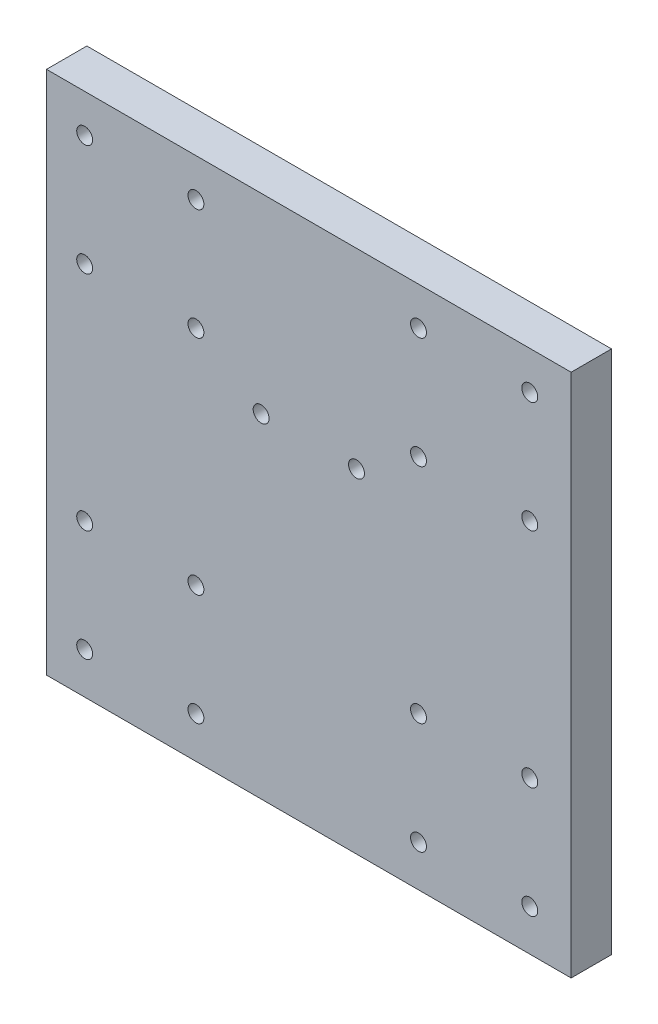
ISO-10303-21;
HEADER;
FILE_DESCRIPTION(('STEP AP214'),'2;1');
FILE_NAME('part.step','',(''),(''),'','','');
FILE_SCHEMA(('AUTOMOTIVE_DESIGN { 1 0 10303 214 1 1 1 1 }'));
ENDSEC;
DATA;
#1=APPLICATION_CONTEXT('core data for automotive mechanical design processes');
#2=APPLICATION_PROTOCOL_DEFINITION('international standard','automotive_design',2000,#1);
#3=PRODUCT_CONTEXT('',#1,'mechanical');
#4=PRODUCT('Part','Part','',(#3));
#5=PRODUCT_RELATED_PRODUCT_CATEGORY('part','',(#4));
#6=PRODUCT_DEFINITION_FORMATION('','',#4);
#7=PRODUCT_DEFINITION_CONTEXT('part definition',#1,'design');
#8=PRODUCT_DEFINITION('design','',#6,#7);
#9=PRODUCT_DEFINITION_SHAPE('','',#8);
#10=(LENGTH_UNIT() NAMED_UNIT(*) SI_UNIT(.MILLI.,.METRE.));
#11=(NAMED_UNIT(*) PLANE_ANGLE_UNIT() SI_UNIT($,.RADIAN.));
#12=(NAMED_UNIT(*) SI_UNIT($,.STERADIAN.) SOLID_ANGLE_UNIT());
#13=UNCERTAINTY_MEASURE_WITH_UNIT(LENGTH_MEASURE(1.E-05),#10,'distance_accuracy_value','');
#14=(GEOMETRIC_REPRESENTATION_CONTEXT(3) GLOBAL_UNCERTAINTY_ASSIGNED_CONTEXT((#13)) GLOBAL_UNIT_ASSIGNED_CONTEXT((#10,
#11,#12)) REPRESENTATION_CONTEXT('',''));
#15=CARTESIAN_POINT('',(0.,0.,0.));
#16=DIRECTION('',(0.,0.,1.));
#17=DIRECTION('',(1.,0.,0.));
#18=AXIS2_PLACEMENT_3D('',#15,#16,#17);
#19=CARTESIAN_POINT('',(0.,0.,12.7));
#20=DIRECTION('',(0.,0.,1.));
#21=DIRECTION('',(1.,0.,0.));
#22=AXIS2_PLACEMENT_3D('',#19,#20,#21);
#23=PLANE('',#22);
#24=CARTESIAN_POINT('',(15.,22.3901064883606,12.7));
#25=DIRECTION('',(0.,0.,1.));
#26=DIRECTION('',(1.,0.,0.));
#27=AXIS2_PLACEMENT_3D('',#24,#25,#26);
#28=CIRCLE('',#27,2.5);
#29=CARTESIAN_POINT('',(17.5,22.3901064883606,12.7));
#30=VERTEX_POINT('',#29);
#31=EDGE_CURVE('E214',#30,#30,#28,.T.);
#32=ORIENTED_EDGE('',*,*,#31,.F.);
#33=EDGE_LOOP('',(#32));
#34=FACE_BOUND('',#33,.T.);
#35=CARTESIAN_POINT('',(-15.,22.3901064883606,12.7));
#36=DIRECTION('',(0.,0.,1.));
#37=DIRECTION('',(1.,0.,0.));
#38=AXIS2_PLACEMENT_3D('',#35,#36,#37);
#39=CIRCLE('',#38,2.5);
#40=CARTESIAN_POINT('',(-12.5,22.3901064883606,12.7));
#41=VERTEX_POINT('',#40);
#42=EDGE_CURVE('E208',#41,#41,#39,.T.);
#43=ORIENTED_EDGE('',*,*,#42,.F.);
#44=EDGE_LOOP('',(#43));
#45=FACE_BOUND('',#44,.T.);
#46=CARTESIAN_POINT('',(-35.4999999999985,-69.5,12.7));
#47=DIRECTION('',(0.,0.,1.));
#48=DIRECTION('',(1.,0.,0.));
#49=AXIS2_PLACEMENT_3D('',#46,#47,#48);
#50=CIRCLE('',#49,2.5);
#51=CARTESIAN_POINT('',(-32.9999999999985,-69.5,12.7));
#52=VERTEX_POINT('',#51);
#53=EDGE_CURVE('E193',#52,#52,#50,.T.);
#54=ORIENTED_EDGE('',*,*,#53,.F.);
#55=EDGE_LOOP('',(#54));
#56=FACE_BOUND('',#55,.T.);
#57=CARTESIAN_POINT('',(-70.4999999999989,-34.5,12.7));
#58=DIRECTION('',(0.,0.,1.));
#59=DIRECTION('',(1.,0.,0.));
#60=AXIS2_PLACEMENT_3D('',#57,#58,#59);
#61=CIRCLE('',#60,2.5);
#62=CARTESIAN_POINT('',(-67.9999999999989,-34.5,12.7));
#63=VERTEX_POINT('',#62);
#64=EDGE_CURVE('E181',#63,#63,#61,.T.);
#65=ORIENTED_EDGE('',*,*,#64,.F.);
#66=EDGE_LOOP('',(#65));
#67=FACE_BOUND('',#66,.T.);
#68=CARTESIAN_POINT('',(69.5000000000014,-69.5,12.7));
#69=DIRECTION('',(0.,0.,1.));
#70=DIRECTION('',(1.,0.,0.));
#71=AXIS2_PLACEMENT_3D('',#68,#69,#70);
#72=CIRCLE('',#71,2.5);
#73=CARTESIAN_POINT('',(72.0000000000014,-69.5,12.7));
#74=VERTEX_POINT('',#73);
#75=EDGE_CURVE('E169',#74,#74,#72,.T.);
#76=ORIENTED_EDGE('',*,*,#75,.F.);
#77=EDGE_LOOP('',(#76));
#78=FACE_BOUND('',#77,.T.);
#79=CARTESIAN_POINT('',(34.5000000000011,-34.5,12.7));
#80=DIRECTION('',(0.,0.,1.));
#81=DIRECTION('',(1.,0.,0.));
#82=AXIS2_PLACEMENT_3D('',#79,#80,#81);
#83=CIRCLE('',#82,2.5);
#84=CARTESIAN_POINT('',(37.0000000000011,-34.5,12.7));
#85=VERTEX_POINT('',#84);
#86=EDGE_CURVE('E157',#85,#85,#83,.T.);
#87=ORIENTED_EDGE('',*,*,#86,.F.);
#88=EDGE_LOOP('',(#87));
#89=FACE_BOUND('',#88,.T.);
#90=CARTESIAN_POINT('',(69.5000000000004,35.5,12.7));
#91=DIRECTION('',(0.,0.,1.));
#92=DIRECTION('',(1.,0.,0.));
#93=AXIS2_PLACEMENT_3D('',#90,#91,#92);
#94=CIRCLE('',#93,2.5);
#95=CARTESIAN_POINT('',(72.0000000000004,35.5,12.7));
#96=VERTEX_POINT('',#95);
#97=EDGE_CURVE('E145',#96,#96,#94,.T.);
#98=ORIENTED_EDGE('',*,*,#97,.F.);
#99=EDGE_LOOP('',(#98));
#100=FACE_BOUND('',#99,.T.);
#101=CARTESIAN_POINT('',(34.5,70.5,12.7));
#102=DIRECTION('',(0.,0.,1.));
#103=DIRECTION('',(1.,0.,0.));
#104=AXIS2_PLACEMENT_3D('',#101,#102,#103);
#105=CIRCLE('',#104,2.5);
#106=CARTESIAN_POINT('',(37.,70.5,12.7));
#107=VERTEX_POINT('',#106);
#108=EDGE_CURVE('E133',#107,#107,#105,.T.);
#109=ORIENTED_EDGE('',*,*,#108,.F.);
#110=EDGE_LOOP('',(#109));
#111=FACE_BOUND('',#110,.T.);
#112=CARTESIAN_POINT('',(-35.4999999999996,35.5,12.7));
#113=DIRECTION('',(0.,0.,1.));
#114=DIRECTION('',(1.,0.,0.));
#115=AXIS2_PLACEMENT_3D('',#112,#113,#114);
#116=CIRCLE('',#115,2.5);
#117=CARTESIAN_POINT('',(-32.9999999999996,35.5,12.7));
#118=VERTEX_POINT('',#117);
#119=EDGE_CURVE('E121',#118,#118,#116,.T.);
#120=ORIENTED_EDGE('',*,*,#119,.F.);
#121=EDGE_LOOP('',(#120));
#122=FACE_BOUND('',#121,.T.);
#123=CARTESIAN_POINT('',(-70.5,70.5,12.7));
#124=DIRECTION('',(0.,0.,1.));
#125=DIRECTION('',(1.,0.,0.));
#126=AXIS2_PLACEMENT_3D('',#123,#124,#125);
#127=CIRCLE('',#126,2.5);
#128=CARTESIAN_POINT('',(-68.,70.5,12.7));
#129=VERTEX_POINT('',#128);
#130=EDGE_CURVE('E100',#129,#129,#127,.T.);
#131=ORIENTED_EDGE('',*,*,#130,.F.);
#132=EDGE_LOOP('',(#131));
#133=FACE_BOUND('',#132,.T.);
#134=DIRECTION('',(0.,-1.,0.));
#135=VECTOR('',#134,1.);
#136=CARTESIAN_POINT('',(-82.5,-82.5,12.7));
#137=LINE('',#136,#135);
#138=CARTESIAN_POINT('',(-82.5,82.5,12.7));
#139=VERTEX_POINT('',#138);
#140=CARTESIAN_POINT('',(-82.5,-82.5,12.7));
#141=VERTEX_POINT('',#140);
#142=EDGE_CURVE('E85',#139,#141,#137,.T.);
#143=ORIENTED_EDGE('',*,*,#142,.T.);
#144=DIRECTION('',(1.,0.,0.));
#145=VECTOR('',#144,1.);
#146=CARTESIAN_POINT('',(82.5,-82.5,12.7));
#147=LINE('',#146,#145);
#148=CARTESIAN_POINT('',(82.5,-82.5,12.7));
#149=VERTEX_POINT('',#148);
#150=EDGE_CURVE('E80',#141,#149,#147,.T.);
#151=ORIENTED_EDGE('',*,*,#150,.T.);
#152=DIRECTION('',(0.,1.,0.));
#153=VECTOR('',#152,1.);
#154=CARTESIAN_POINT('',(82.5,-82.5,12.7));
#155=LINE('',#154,#153);
#156=CARTESIAN_POINT('',(82.5,82.5,12.7));
#157=VERTEX_POINT('',#156);
#158=EDGE_CURVE('E83',#149,#157,#155,.T.);
#159=ORIENTED_EDGE('',*,*,#158,.T.);
#160=DIRECTION('',(-1.,0.,0.));
#161=VECTOR('',#160,1.);
#162=CARTESIAN_POINT('',(82.5,82.5,12.7));
#163=LINE('',#162,#161);
#164=EDGE_CURVE('E50',#157,#139,#163,.T.);
#165=ORIENTED_EDGE('',*,*,#164,.T.);
#166=EDGE_LOOP('',(#143,#151,#159,#165));
#167=FACE_BOUND('',#166,.T.);
#168=CARTESIAN_POINT('',(-35.5,70.5,12.7));
#169=DIRECTION('',(0.,0.,1.));
#170=DIRECTION('',(1.,0.,0.));
#171=AXIS2_PLACEMENT_3D('',#168,#169,#170);
#172=CIRCLE('',#171,2.5);
#173=CARTESIAN_POINT('',(-33.,70.5,12.7));
#174=VERTEX_POINT('',#173);
#175=EDGE_CURVE('E115',#174,#174,#172,.T.);
#176=ORIENTED_EDGE('',*,*,#175,.F.);
#177=EDGE_LOOP('',(#176));
#178=FACE_BOUND('',#177,.T.);
#179=CARTESIAN_POINT('',(-70.4999999999996,35.5,12.7));
#180=DIRECTION('',(0.,0.,1.));
#181=DIRECTION('',(1.,0.,0.));
#182=AXIS2_PLACEMENT_3D('',#179,#180,#181);
#183=CIRCLE('',#182,2.5);
#184=CARTESIAN_POINT('',(-67.9999999999996,35.5,12.7));
#185=VERTEX_POINT('',#184);
#186=EDGE_CURVE('E127',#185,#185,#183,.T.);
#187=ORIENTED_EDGE('',*,*,#186,.F.);
#188=EDGE_LOOP('',(#187));
#189=FACE_BOUND('',#188,.T.);
#190=CARTESIAN_POINT('',(69.5,70.5,12.7));
#191=DIRECTION('',(0.,0.,1.));
#192=DIRECTION('',(1.,0.,0.));
#193=AXIS2_PLACEMENT_3D('',#190,#191,#192);
#194=CIRCLE('',#193,2.5);
#195=CARTESIAN_POINT('',(72.,70.5,12.7));
#196=VERTEX_POINT('',#195);
#197=EDGE_CURVE('E139',#196,#196,#194,.T.);
#198=ORIENTED_EDGE('',*,*,#197,.F.);
#199=EDGE_LOOP('',(#198));
#200=FACE_BOUND('',#199,.T.);
#201=CARTESIAN_POINT('',(34.5000000000003,35.5,12.7));
#202=DIRECTION('',(0.,0.,1.));
#203=DIRECTION('',(1.,0.,0.));
#204=AXIS2_PLACEMENT_3D('',#201,#202,#203);
#205=CIRCLE('',#204,2.5);
#206=CARTESIAN_POINT('',(37.0000000000003,35.5,12.7));
#207=VERTEX_POINT('',#206);
#208=EDGE_CURVE('E151',#207,#207,#205,.T.);
#209=ORIENTED_EDGE('',*,*,#208,.F.);
#210=EDGE_LOOP('',(#209));
#211=FACE_BOUND('',#210,.T.);
#212=CARTESIAN_POINT('',(69.5000000000011,-34.5,12.7));
#213=DIRECTION('',(0.,0.,1.));
#214=DIRECTION('',(1.,0.,0.));
#215=AXIS2_PLACEMENT_3D('',#212,#213,#214);
#216=CIRCLE('',#215,2.5);
#217=CARTESIAN_POINT('',(72.0000000000011,-34.5,12.7));
#218=VERTEX_POINT('',#217);
#219=EDGE_CURVE('E163',#218,#218,#216,.T.);
#220=ORIENTED_EDGE('',*,*,#219,.F.);
#221=EDGE_LOOP('',(#220));
#222=FACE_BOUND('',#221,.T.);
#223=CARTESIAN_POINT('',(34.5000000000014,-69.5,12.7));
#224=DIRECTION('',(0.,0.,1.));
#225=DIRECTION('',(1.,0.,0.));
#226=AXIS2_PLACEMENT_3D('',#223,#224,#225);
#227=CIRCLE('',#226,2.5);
#228=CARTESIAN_POINT('',(37.0000000000014,-69.5,12.7));
#229=VERTEX_POINT('',#228);
#230=EDGE_CURVE('E175',#229,#229,#227,.T.);
#231=ORIENTED_EDGE('',*,*,#230,.F.);
#232=EDGE_LOOP('',(#231));
#233=FACE_BOUND('',#232,.T.);
#234=CARTESIAN_POINT('',(-35.4999999999989,-34.5,12.7));
#235=DIRECTION('',(0.,0.,1.));
#236=DIRECTION('',(1.,0.,0.));
#237=AXIS2_PLACEMENT_3D('',#234,#235,#236);
#238=CIRCLE('',#237,2.5);
#239=CARTESIAN_POINT('',(-32.9999999999989,-34.5,12.7));
#240=VERTEX_POINT('',#239);
#241=EDGE_CURVE('E187',#240,#240,#238,.T.);
#242=ORIENTED_EDGE('',*,*,#241,.F.);
#243=EDGE_LOOP('',(#242));
#244=FACE_BOUND('',#243,.T.);
#245=CARTESIAN_POINT('',(-70.4999999999986,-69.5,12.7));
#246=DIRECTION('',(0.,0.,1.));
#247=DIRECTION('',(1.,0.,0.));
#248=AXIS2_PLACEMENT_3D('',#245,#246,#247);
#249=CIRCLE('',#248,2.5);
#250=CARTESIAN_POINT('',(-67.9999999999986,-69.5,12.7));
#251=VERTEX_POINT('',#250);
#252=EDGE_CURVE('E199',#251,#251,#249,.T.);
#253=ORIENTED_EDGE('',*,*,#252,.F.);
#254=EDGE_LOOP('',(#253));
#255=FACE_BOUND('',#254,.T.);
#256=ADVANCED_FACE('F33',(#34,#45,#56,#67,#78,#89,#100,#111,#122,#133,#167,#178,#189,#200,#211,
#222,#233,#244,#255),#23,.T.);
#257=CARTESIAN_POINT('',(0.,0.,0.));
#258=DIRECTION('',(0.,0.,1.));
#259=DIRECTION('',(1.,0.,0.));
#260=AXIS2_PLACEMENT_3D('',#257,#258,#259);
#261=PLANE('',#260);
#262=CARTESIAN_POINT('',(15.,22.3901064883606,0.));
#263=DIRECTION('',(0.,0.,1.));
#264=DIRECTION('',(1.,0.,0.));
#265=AXIS2_PLACEMENT_3D('',#262,#263,#264);
#266=CIRCLE('',#265,2.5);
#267=CARTESIAN_POINT('',(17.5,22.3901064883606,0.));
#268=VERTEX_POINT('',#267);
#269=EDGE_CURVE('E211',#268,#268,#266,.T.);
#270=ORIENTED_EDGE('',*,*,#269,.T.);
#271=EDGE_LOOP('',(#270));
#272=FACE_BOUND('',#271,.T.);
#273=CARTESIAN_POINT('',(-15.,22.3901064883606,0.));
#274=DIRECTION('',(0.,0.,1.));
#275=DIRECTION('',(1.,0.,0.));
#276=AXIS2_PLACEMENT_3D('',#273,#274,#275);
#277=CIRCLE('',#276,2.5);
#278=CARTESIAN_POINT('',(-12.5,22.3901064883606,0.));
#279=VERTEX_POINT('',#278);
#280=EDGE_CURVE('E205',#279,#279,#277,.T.);
#281=ORIENTED_EDGE('',*,*,#280,.T.);
#282=EDGE_LOOP('',(#281));
#283=FACE_BOUND('',#282,.T.);
#284=DIRECTION('',(0.,-1.,0.));
#285=VECTOR('',#284,1.);
#286=CARTESIAN_POINT('',(-82.5,-82.5,0.));
#287=LINE('',#286,#285);
#288=CARTESIAN_POINT('',(-82.5,82.5,0.));
#289=VERTEX_POINT('',#288);
#290=CARTESIAN_POINT('',(-82.5,-82.5,0.));
#291=VERTEX_POINT('',#290);
#292=EDGE_CURVE('E97',#289,#291,#287,.T.);
#293=ORIENTED_EDGE('',*,*,#292,.F.);
#294=DIRECTION('',(-1.,0.,0.));
#295=VECTOR('',#294,1.);
#296=CARTESIAN_POINT('',(82.5,82.5,0.));
#297=LINE('',#296,#295);
#298=CARTESIAN_POINT('',(82.5,82.5,0.));
#299=VERTEX_POINT('',#298);
#300=EDGE_CURVE('E73',#299,#289,#297,.T.);
#301=ORIENTED_EDGE('',*,*,#300,.F.);
#302=DIRECTION('',(0.,1.,0.));
#303=VECTOR('',#302,1.);
#304=CARTESIAN_POINT('',(82.5,-82.5,0.));
#305=LINE('',#304,#303);
#306=CARTESIAN_POINT('',(82.5,-82.5,0.));
#307=VERTEX_POINT('',#306);
#308=EDGE_CURVE('E67',#307,#299,#305,.T.);
#309=ORIENTED_EDGE('',*,*,#308,.F.);
#310=DIRECTION('',(1.,0.,0.));
#311=VECTOR('',#310,1.);
#312=CARTESIAN_POINT('',(82.5,-82.5,0.));
#313=LINE('',#312,#311);
#314=EDGE_CURVE('E89',#291,#307,#313,.T.);
#315=ORIENTED_EDGE('',*,*,#314,.F.);
#316=EDGE_LOOP('',(#293,#301,#309,#315));
#317=FACE_BOUND('',#316,.T.);
#318=CARTESIAN_POINT('',(-70.5,70.5,0.));
#319=DIRECTION('',(0.,0.,1.));
#320=DIRECTION('',(1.,0.,0.));
#321=AXIS2_PLACEMENT_3D('',#318,#319,#320);
#322=CIRCLE('',#321,2.5);
#323=CARTESIAN_POINT('',(-68.,70.5,0.));
#324=VERTEX_POINT('',#323);
#325=EDGE_CURVE('E112',#324,#324,#322,.T.);
#326=ORIENTED_EDGE('',*,*,#325,.T.);
#327=EDGE_LOOP('',(#326));
#328=FACE_BOUND('',#327,.T.);
#329=CARTESIAN_POINT('',(-35.5,70.5,0.));
#330=DIRECTION('',(0.,0.,1.));
#331=DIRECTION('',(1.,0.,0.));
#332=AXIS2_PLACEMENT_3D('',#329,#330,#331);
#333=CIRCLE('',#332,2.5);
#334=CARTESIAN_POINT('',(-33.,70.5,0.));
#335=VERTEX_POINT('',#334);
#336=EDGE_CURVE('E118',#335,#335,#333,.T.);
#337=ORIENTED_EDGE('',*,*,#336,.T.);
#338=EDGE_LOOP('',(#337));
#339=FACE_BOUND('',#338,.T.);
#340=CARTESIAN_POINT('',(-35.4999999999996,35.5,0.));
#341=DIRECTION('',(0.,0.,1.));
#342=DIRECTION('',(1.,0.,0.));
#343=AXIS2_PLACEMENT_3D('',#340,#341,#342);
#344=CIRCLE('',#343,2.5);
#345=CARTESIAN_POINT('',(-32.9999999999996,35.5,0.));
#346=VERTEX_POINT('',#345);
#347=EDGE_CURVE('E124',#346,#346,#344,.T.);
#348=ORIENTED_EDGE('',*,*,#347,.T.);
#349=EDGE_LOOP('',(#348));
#350=FACE_BOUND('',#349,.T.);
#351=CARTESIAN_POINT('',(-70.4999999999996,35.5,0.));
#352=DIRECTION('',(0.,0.,1.));
#353=DIRECTION('',(1.,0.,0.));
#354=AXIS2_PLACEMENT_3D('',#351,#352,#353);
#355=CIRCLE('',#354,2.5);
#356=CARTESIAN_POINT('',(-67.9999999999996,35.5,0.));
#357=VERTEX_POINT('',#356);
#358=EDGE_CURVE('E130',#357,#357,#355,.T.);
#359=ORIENTED_EDGE('',*,*,#358,.T.);
#360=EDGE_LOOP('',(#359));
#361=FACE_BOUND('',#360,.T.);
#362=CARTESIAN_POINT('',(34.5,70.5,0.));
#363=DIRECTION('',(0.,0.,1.));
#364=DIRECTION('',(1.,0.,0.));
#365=AXIS2_PLACEMENT_3D('',#362,#363,#364);
#366=CIRCLE('',#365,2.5);
#367=CARTESIAN_POINT('',(37.,70.5,0.));
#368=VERTEX_POINT('',#367);
#369=EDGE_CURVE('E136',#368,#368,#366,.T.);
#370=ORIENTED_EDGE('',*,*,#369,.T.);
#371=EDGE_LOOP('',(#370));
#372=FACE_BOUND('',#371,.T.);
#373=CARTESIAN_POINT('',(69.5,70.5,0.));
#374=DIRECTION('',(0.,0.,1.));
#375=DIRECTION('',(1.,0.,0.));
#376=AXIS2_PLACEMENT_3D('',#373,#374,#375);
#377=CIRCLE('',#376,2.5);
#378=CARTESIAN_POINT('',(72.,70.5,0.));
#379=VERTEX_POINT('',#378);
#380=EDGE_CURVE('E142',#379,#379,#377,.T.);
#381=ORIENTED_EDGE('',*,*,#380,.T.);
#382=EDGE_LOOP('',(#381));
#383=FACE_BOUND('',#382,.T.);
#384=CARTESIAN_POINT('',(69.5000000000004,35.5,0.));
#385=DIRECTION('',(0.,0.,1.));
#386=DIRECTION('',(1.,0.,0.));
#387=AXIS2_PLACEMENT_3D('',#384,#385,#386);
#388=CIRCLE('',#387,2.5);
#389=CARTESIAN_POINT('',(72.0000000000004,35.5,0.));
#390=VERTEX_POINT('',#389);
#391=EDGE_CURVE('E148',#390,#390,#388,.T.);
#392=ORIENTED_EDGE('',*,*,#391,.T.);
#393=EDGE_LOOP('',(#392));
#394=FACE_BOUND('',#393,.T.);
#395=CARTESIAN_POINT('',(34.5000000000003,35.5,0.));
#396=DIRECTION('',(0.,0.,1.));
#397=DIRECTION('',(1.,0.,0.));
#398=AXIS2_PLACEMENT_3D('',#395,#396,#397);
#399=CIRCLE('',#398,2.5);
#400=CARTESIAN_POINT('',(37.0000000000003,35.5,0.));
#401=VERTEX_POINT('',#400);
#402=EDGE_CURVE('E154',#401,#401,#399,.T.);
#403=ORIENTED_EDGE('',*,*,#402,.T.);
#404=EDGE_LOOP('',(#403));
#405=FACE_BOUND('',#404,.T.);
#406=CARTESIAN_POINT('',(34.5000000000011,-34.5,0.));
#407=DIRECTION('',(0.,0.,1.));
#408=DIRECTION('',(1.,0.,0.));
#409=AXIS2_PLACEMENT_3D('',#406,#407,#408);
#410=CIRCLE('',#409,2.5);
#411=CARTESIAN_POINT('',(37.0000000000011,-34.5,0.));
#412=VERTEX_POINT('',#411);
#413=EDGE_CURVE('E160',#412,#412,#410,.T.);
#414=ORIENTED_EDGE('',*,*,#413,.T.);
#415=EDGE_LOOP('',(#414));
#416=FACE_BOUND('',#415,.T.);
#417=CARTESIAN_POINT('',(69.5000000000011,-34.5,0.));
#418=DIRECTION('',(0.,0.,1.));
#419=DIRECTION('',(1.,0.,0.));
#420=AXIS2_PLACEMENT_3D('',#417,#418,#419);
#421=CIRCLE('',#420,2.5);
#422=CARTESIAN_POINT('',(72.0000000000011,-34.5,0.));
#423=VERTEX_POINT('',#422);
#424=EDGE_CURVE('E166',#423,#423,#421,.T.);
#425=ORIENTED_EDGE('',*,*,#424,.T.);
#426=EDGE_LOOP('',(#425));
#427=FACE_BOUND('',#426,.T.);
#428=CARTESIAN_POINT('',(69.5000000000014,-69.5,0.));
#429=DIRECTION('',(0.,0.,1.));
#430=DIRECTION('',(1.,0.,0.));
#431=AXIS2_PLACEMENT_3D('',#428,#429,#430);
#432=CIRCLE('',#431,2.5);
#433=CARTESIAN_POINT('',(72.0000000000014,-69.5,0.));
#434=VERTEX_POINT('',#433);
#435=EDGE_CURVE('E172',#434,#434,#432,.T.);
#436=ORIENTED_EDGE('',*,*,#435,.T.);
#437=EDGE_LOOP('',(#436));
#438=FACE_BOUND('',#437,.T.);
#439=CARTESIAN_POINT('',(34.5000000000014,-69.5,0.));
#440=DIRECTION('',(0.,0.,1.));
#441=DIRECTION('',(1.,0.,0.));
#442=AXIS2_PLACEMENT_3D('',#439,#440,#441);
#443=CIRCLE('',#442,2.5);
#444=CARTESIAN_POINT('',(37.0000000000014,-69.5,0.));
#445=VERTEX_POINT('',#444);
#446=EDGE_CURVE('E178',#445,#445,#443,.T.);
#447=ORIENTED_EDGE('',*,*,#446,.T.);
#448=EDGE_LOOP('',(#447));
#449=FACE_BOUND('',#448,.T.);
#450=CARTESIAN_POINT('',(-70.4999999999989,-34.5,0.));
#451=DIRECTION('',(0.,0.,1.));
#452=DIRECTION('',(1.,0.,0.));
#453=AXIS2_PLACEMENT_3D('',#450,#451,#452);
#454=CIRCLE('',#453,2.5);
#455=CARTESIAN_POINT('',(-67.9999999999989,-34.5,0.));
#456=VERTEX_POINT('',#455);
#457=EDGE_CURVE('E184',#456,#456,#454,.T.);
#458=ORIENTED_EDGE('',*,*,#457,.T.);
#459=EDGE_LOOP('',(#458));
#460=FACE_BOUND('',#459,.T.);
#461=CARTESIAN_POINT('',(-35.4999999999989,-34.5,0.));
#462=DIRECTION('',(0.,0.,1.));
#463=DIRECTION('',(1.,0.,0.));
#464=AXIS2_PLACEMENT_3D('',#461,#462,#463);
#465=CIRCLE('',#464,2.5);
#466=CARTESIAN_POINT('',(-32.9999999999989,-34.5,0.));
#467=VERTEX_POINT('',#466);
#468=EDGE_CURVE('E190',#467,#467,#465,.T.);
#469=ORIENTED_EDGE('',*,*,#468,.T.);
#470=EDGE_LOOP('',(#469));
#471=FACE_BOUND('',#470,.T.);
#472=CARTESIAN_POINT('',(-35.4999999999985,-69.5,0.));
#473=DIRECTION('',(0.,0.,1.));
#474=DIRECTION('',(1.,0.,0.));
#475=AXIS2_PLACEMENT_3D('',#472,#473,#474);
#476=CIRCLE('',#475,2.5);
#477=CARTESIAN_POINT('',(-32.9999999999985,-69.5,0.));
#478=VERTEX_POINT('',#477);
#479=EDGE_CURVE('E196',#478,#478,#476,.T.);
#480=ORIENTED_EDGE('',*,*,#479,.T.);
#481=EDGE_LOOP('',(#480));
#482=FACE_BOUND('',#481,.T.);
#483=CARTESIAN_POINT('',(-70.4999999999986,-69.5,0.));
#484=DIRECTION('',(0.,0.,1.));
#485=DIRECTION('',(1.,0.,0.));
#486=AXIS2_PLACEMENT_3D('',#483,#484,#485);
#487=CIRCLE('',#486,2.5);
#488=CARTESIAN_POINT('',(-67.9999999999986,-69.5,0.));
#489=VERTEX_POINT('',#488);
#490=EDGE_CURVE('E202',#489,#489,#487,.T.);
#491=ORIENTED_EDGE('',*,*,#490,.T.);
#492=EDGE_LOOP('',(#491));
#493=FACE_BOUND('',#492,.T.);
#494=ADVANCED_FACE('F108',(#272,#283,#317,#328,#339,#350,#361,#372,#383,#394,#405,#416,#427,
#438,#449,#460,#471,#482,#493),#261,.F.);
#495=CARTESIAN_POINT('',(-82.5,-82.5,12.7));
#496=DIRECTION('',(1.,0.,0.));
#497=DIRECTION('',(0.,0.,-1.));
#498=AXIS2_PLACEMENT_3D('',#495,#496,#497);
#499=PLANE('',#498);
#500=ORIENTED_EDGE('',*,*,#292,.T.);
#501=DIRECTION('',(0.,0.,-1.));
#502=VECTOR('',#501,1.);
#503=CARTESIAN_POINT('',(-82.5,-82.5,12.7));
#504=LINE('',#503,#502);
#505=EDGE_CURVE('E11',#141,#291,#504,.T.);
#506=ORIENTED_EDGE('',*,*,#505,.F.);
#507=ORIENTED_EDGE('',*,*,#142,.F.);
#508=DIRECTION('',(0.,0.,-1.));
#509=VECTOR('',#508,1.);
#510=CARTESIAN_POINT('',(-82.5,82.5,12.7));
#511=LINE('',#510,#509);
#512=EDGE_CURVE('E93',#139,#289,#511,.T.);
#513=ORIENTED_EDGE('',*,*,#512,.T.);
#514=EDGE_LOOP('',(#500,#506,#507,#513));
#515=FACE_BOUND('',#514,.T.);
#516=ADVANCED_FACE('F35',(#515),#499,.F.);
#517=CARTESIAN_POINT('',(82.5,-82.5,12.7));
#518=DIRECTION('',(0.,1.,0.));
#519=DIRECTION('',(-1.,0.,0.));
#520=AXIS2_PLACEMENT_3D('',#517,#518,#519);
#521=PLANE('',#520);
#522=ORIENTED_EDGE('',*,*,#314,.T.);
#523=DIRECTION('',(0.,0.,-1.));
#524=VECTOR('',#523,1.);
#525=CARTESIAN_POINT('',(82.5,-82.5,12.7));
#526=LINE('',#525,#524);
#527=EDGE_CURVE('E42',#149,#307,#526,.T.);
#528=ORIENTED_EDGE('',*,*,#527,.F.);
#529=ORIENTED_EDGE('',*,*,#150,.F.);
#530=ORIENTED_EDGE('',*,*,#505,.T.);
#531=EDGE_LOOP('',(#522,#528,#529,#530));
#532=FACE_BOUND('',#531,.T.);
#533=ADVANCED_FACE('F88',(#532),#521,.F.);
#534=CARTESIAN_POINT('',(82.5,-82.5,12.7));
#535=DIRECTION('',(-1.,0.,0.));
#536=DIRECTION('',(0.,0.,1.));
#537=AXIS2_PLACEMENT_3D('',#534,#535,#536);
#538=PLANE('',#537);
#539=ORIENTED_EDGE('',*,*,#308,.T.);
#540=DIRECTION('',(0.,0.,-1.));
#541=VECTOR('',#540,1.);
#542=CARTESIAN_POINT('',(82.5,82.5,12.7));
#543=LINE('',#542,#541);
#544=EDGE_CURVE('E90',#157,#299,#543,.T.);
#545=ORIENTED_EDGE('',*,*,#544,.F.);
#546=ORIENTED_EDGE('',*,*,#158,.F.);
#547=ORIENTED_EDGE('',*,*,#527,.T.);
#548=EDGE_LOOP('',(#539,#545,#546,#547));
#549=FACE_BOUND('',#548,.T.);
#550=ADVANCED_FACE('F91',(#549),#538,.F.);
#551=CARTESIAN_POINT('',(82.5,82.5,12.7));
#552=DIRECTION('',(0.,-1.,0.));
#553=DIRECTION('',(1.,0.,0.));
#554=AXIS2_PLACEMENT_3D('',#551,#552,#553);
#555=PLANE('',#554);
#556=ORIENTED_EDGE('',*,*,#300,.T.);
#557=ORIENTED_EDGE('',*,*,#512,.F.);
#558=ORIENTED_EDGE('',*,*,#164,.F.);
#559=ORIENTED_EDGE('',*,*,#544,.T.);
#560=EDGE_LOOP('',(#556,#557,#558,#559));
#561=FACE_BOUND('',#560,.T.);
#562=ADVANCED_FACE('F105',(#561),#555,.F.);
#563=CARTESIAN_POINT('',(-70.5,70.5,12.7));
#564=DIRECTION('',(0.,0.,-1.));
#565=DIRECTION('',(-1.,0.,0.));
#566=AXIS2_PLACEMENT_3D('',#563,#564,#565);
#567=CYLINDRICAL_SURFACE('',#566,2.5);
#568=ORIENTED_EDGE('',*,*,#130,.T.);
#569=EDGE_LOOP('',(#568));
#570=FACE_BOUND('',#569,.T.);
#571=ORIENTED_EDGE('',*,*,#325,.F.);
#572=EDGE_LOOP('',(#571));
#573=FACE_BOUND('',#572,.T.);
#574=ADVANCED_FACE('F250',(#570,#573),#567,.F.);
#575=CARTESIAN_POINT('',(-35.5,70.5,12.7));
#576=DIRECTION('',(0.,0.,-1.));
#577=DIRECTION('',(-1.,0.,0.));
#578=AXIS2_PLACEMENT_3D('',#575,#576,#577);
#579=CYLINDRICAL_SURFACE('',#578,2.5);
#580=ORIENTED_EDGE('',*,*,#175,.T.);
#581=EDGE_LOOP('',(#580));
#582=FACE_BOUND('',#581,.T.);
#583=ORIENTED_EDGE('',*,*,#336,.F.);
#584=EDGE_LOOP('',(#583));
#585=FACE_BOUND('',#584,.T.);
#586=ADVANCED_FACE('F253',(#582,#585),#579,.F.);
#587=CARTESIAN_POINT('',(-35.4999999999996,35.5,12.7));
#588=DIRECTION('',(0.,0.,-1.));
#589=DIRECTION('',(-1.,0.,0.));
#590=AXIS2_PLACEMENT_3D('',#587,#588,#589);
#591=CYLINDRICAL_SURFACE('',#590,2.5);
#592=ORIENTED_EDGE('',*,*,#119,.T.);
#593=EDGE_LOOP('',(#592));
#594=FACE_BOUND('',#593,.T.);
#595=ORIENTED_EDGE('',*,*,#347,.F.);
#596=EDGE_LOOP('',(#595));
#597=FACE_BOUND('',#596,.T.);
#598=ADVANCED_FACE('F346',(#594,#597),#591,.F.);
#599=CARTESIAN_POINT('',(-70.4999999999996,35.5,12.7));
#600=DIRECTION('',(0.,0.,-1.));
#601=DIRECTION('',(-1.,0.,0.));
#602=AXIS2_PLACEMENT_3D('',#599,#600,#601);
#603=CYLINDRICAL_SURFACE('',#602,2.5);
#604=ORIENTED_EDGE('',*,*,#186,.T.);
#605=EDGE_LOOP('',(#604));
#606=FACE_BOUND('',#605,.T.);
#607=ORIENTED_EDGE('',*,*,#358,.F.);
#608=EDGE_LOOP('',(#607));
#609=FACE_BOUND('',#608,.T.);
#610=ADVANCED_FACE('F342',(#606,#609),#603,.F.);
#611=CARTESIAN_POINT('',(34.5,70.5,12.7));
#612=DIRECTION('',(0.,0.,-1.));
#613=DIRECTION('',(-1.,0.,0.));
#614=AXIS2_PLACEMENT_3D('',#611,#612,#613);
#615=CYLINDRICAL_SURFACE('',#614,2.5);
#616=ORIENTED_EDGE('',*,*,#108,.T.);
#617=EDGE_LOOP('',(#616));
#618=FACE_BOUND('',#617,.T.);
#619=ORIENTED_EDGE('',*,*,#369,.F.);
#620=EDGE_LOOP('',(#619));
#621=FACE_BOUND('',#620,.T.);
#622=ADVANCED_FACE('F338',(#618,#621),#615,.F.);
#623=CARTESIAN_POINT('',(69.5,70.5,12.7));
#624=DIRECTION('',(0.,0.,-1.));
#625=DIRECTION('',(-1.,0.,0.));
#626=AXIS2_PLACEMENT_3D('',#623,#624,#625);
#627=CYLINDRICAL_SURFACE('',#626,2.5);
#628=ORIENTED_EDGE('',*,*,#197,.T.);
#629=EDGE_LOOP('',(#628));
#630=FACE_BOUND('',#629,.T.);
#631=ORIENTED_EDGE('',*,*,#380,.F.);
#632=EDGE_LOOP('',(#631));
#633=FACE_BOUND('',#632,.T.);
#634=ADVANCED_FACE('F334',(#630,#633),#627,.F.);
#635=CARTESIAN_POINT('',(69.5000000000004,35.5,12.7));
#636=DIRECTION('',(0.,0.,-1.));
#637=DIRECTION('',(-1.,0.,0.));
#638=AXIS2_PLACEMENT_3D('',#635,#636,#637);
#639=CYLINDRICAL_SURFACE('',#638,2.5);
#640=ORIENTED_EDGE('',*,*,#97,.T.);
#641=EDGE_LOOP('',(#640));
#642=FACE_BOUND('',#641,.T.);
#643=ORIENTED_EDGE('',*,*,#391,.F.);
#644=EDGE_LOOP('',(#643));
#645=FACE_BOUND('',#644,.T.);
#646=ADVANCED_FACE('F330',(#642,#645),#639,.F.);
#647=CARTESIAN_POINT('',(34.5000000000003,35.5,12.7));
#648=DIRECTION('',(0.,0.,-1.));
#649=DIRECTION('',(-1.,0.,0.));
#650=AXIS2_PLACEMENT_3D('',#647,#648,#649);
#651=CYLINDRICAL_SURFACE('',#650,2.5);
#652=ORIENTED_EDGE('',*,*,#208,.T.);
#653=EDGE_LOOP('',(#652));
#654=FACE_BOUND('',#653,.T.);
#655=ORIENTED_EDGE('',*,*,#402,.F.);
#656=EDGE_LOOP('',(#655));
#657=FACE_BOUND('',#656,.T.);
#658=ADVANCED_FACE('F326',(#654,#657),#651,.F.);
#659=CARTESIAN_POINT('',(34.5000000000011,-34.5,12.7));
#660=DIRECTION('',(0.,0.,-1.));
#661=DIRECTION('',(-1.,0.,0.));
#662=AXIS2_PLACEMENT_3D('',#659,#660,#661);
#663=CYLINDRICAL_SURFACE('',#662,2.5);
#664=ORIENTED_EDGE('',*,*,#86,.T.);
#665=EDGE_LOOP('',(#664));
#666=FACE_BOUND('',#665,.T.);
#667=ORIENTED_EDGE('',*,*,#413,.F.);
#668=EDGE_LOOP('',(#667));
#669=FACE_BOUND('',#668,.T.);
#670=ADVANCED_FACE('F322',(#666,#669),#663,.F.);
#671=CARTESIAN_POINT('',(69.5000000000011,-34.5,12.7));
#672=DIRECTION('',(0.,0.,-1.));
#673=DIRECTION('',(-1.,0.,0.));
#674=AXIS2_PLACEMENT_3D('',#671,#672,#673);
#675=CYLINDRICAL_SURFACE('',#674,2.5);
#676=ORIENTED_EDGE('',*,*,#219,.T.);
#677=EDGE_LOOP('',(#676));
#678=FACE_BOUND('',#677,.T.);
#679=ORIENTED_EDGE('',*,*,#424,.F.);
#680=EDGE_LOOP('',(#679));
#681=FACE_BOUND('',#680,.T.);
#682=ADVANCED_FACE('F318',(#678,#681),#675,.F.);
#683=CARTESIAN_POINT('',(69.5000000000014,-69.5,12.7));
#684=DIRECTION('',(0.,0.,-1.));
#685=DIRECTION('',(-1.,0.,0.));
#686=AXIS2_PLACEMENT_3D('',#683,#684,#685);
#687=CYLINDRICAL_SURFACE('',#686,2.5);
#688=ORIENTED_EDGE('',*,*,#75,.T.);
#689=EDGE_LOOP('',(#688));
#690=FACE_BOUND('',#689,.T.);
#691=ORIENTED_EDGE('',*,*,#435,.F.);
#692=EDGE_LOOP('',(#691));
#693=FACE_BOUND('',#692,.T.);
#694=ADVANCED_FACE('F314',(#690,#693),#687,.F.);
#695=CARTESIAN_POINT('',(34.5000000000014,-69.5,12.7));
#696=DIRECTION('',(0.,0.,-1.));
#697=DIRECTION('',(-1.,0.,0.));
#698=AXIS2_PLACEMENT_3D('',#695,#696,#697);
#699=CYLINDRICAL_SURFACE('',#698,2.5);
#700=ORIENTED_EDGE('',*,*,#230,.T.);
#701=EDGE_LOOP('',(#700));
#702=FACE_BOUND('',#701,.T.);
#703=ORIENTED_EDGE('',*,*,#446,.F.);
#704=EDGE_LOOP('',(#703));
#705=FACE_BOUND('',#704,.T.);
#706=ADVANCED_FACE('F310',(#702,#705),#699,.F.);
#707=CARTESIAN_POINT('',(-70.4999999999989,-34.5,12.7));
#708=DIRECTION('',(0.,0.,-1.));
#709=DIRECTION('',(-1.,0.,0.));
#710=AXIS2_PLACEMENT_3D('',#707,#708,#709);
#711=CYLINDRICAL_SURFACE('',#710,2.5);
#712=ORIENTED_EDGE('',*,*,#64,.T.);
#713=EDGE_LOOP('',(#712));
#714=FACE_BOUND('',#713,.T.);
#715=ORIENTED_EDGE('',*,*,#457,.F.);
#716=EDGE_LOOP('',(#715));
#717=FACE_BOUND('',#716,.T.);
#718=ADVANCED_FACE('F306',(#714,#717),#711,.F.);
#719=CARTESIAN_POINT('',(-35.4999999999989,-34.5,12.7));
#720=DIRECTION('',(0.,0.,-1.));
#721=DIRECTION('',(-1.,0.,0.));
#722=AXIS2_PLACEMENT_3D('',#719,#720,#721);
#723=CYLINDRICAL_SURFACE('',#722,2.5);
#724=ORIENTED_EDGE('',*,*,#241,.T.);
#725=EDGE_LOOP('',(#724));
#726=FACE_BOUND('',#725,.T.);
#727=ORIENTED_EDGE('',*,*,#468,.F.);
#728=EDGE_LOOP('',(#727));
#729=FACE_BOUND('',#728,.T.);
#730=ADVANCED_FACE('F300',(#726,#729),#723,.F.);
#731=CARTESIAN_POINT('',(-35.4999999999985,-69.5,12.7));
#732=DIRECTION('',(0.,0.,-1.));
#733=DIRECTION('',(-1.,0.,0.));
#734=AXIS2_PLACEMENT_3D('',#731,#732,#733);
#735=CYLINDRICAL_SURFACE('',#734,2.5);
#736=ORIENTED_EDGE('',*,*,#53,.T.);
#737=EDGE_LOOP('',(#736));
#738=FACE_BOUND('',#737,.T.);
#739=ORIENTED_EDGE('',*,*,#479,.F.);
#740=EDGE_LOOP('',(#739));
#741=FACE_BOUND('',#740,.T.);
#742=ADVANCED_FACE('F291',(#738,#741),#735,.F.);
#743=CARTESIAN_POINT('',(-70.4999999999986,-69.5,12.7));
#744=DIRECTION('',(0.,0.,-1.));
#745=DIRECTION('',(-1.,0.,0.));
#746=AXIS2_PLACEMENT_3D('',#743,#744,#745);
#747=CYLINDRICAL_SURFACE('',#746,2.5);
#748=ORIENTED_EDGE('',*,*,#252,.T.);
#749=EDGE_LOOP('',(#748));
#750=FACE_BOUND('',#749,.T.);
#751=ORIENTED_EDGE('',*,*,#490,.F.);
#752=EDGE_LOOP('',(#751));
#753=FACE_BOUND('',#752,.T.);
#754=ADVANCED_FACE('F289',(#750,#753),#747,.F.);
#755=CARTESIAN_POINT('',(-15.,22.3901064883606,0.));
#756=DIRECTION('',(0.,0.,1.));
#757=DIRECTION('',(1.,0.,0.));
#758=AXIS2_PLACEMENT_3D('',#755,#756,#757);
#759=CYLINDRICAL_SURFACE('',#758,2.5);
#760=ORIENTED_EDGE('',*,*,#280,.F.);
#761=EDGE_LOOP('',(#760));
#762=FACE_BOUND('',#761,.T.);
#763=ORIENTED_EDGE('',*,*,#42,.T.);
#764=EDGE_LOOP('',(#763));
#765=FACE_BOUND('',#764,.T.);
#766=ADVANCED_FACE('F225',(#762,#765),#759,.F.);
#767=CARTESIAN_POINT('',(15.,22.3901064883606,0.));
#768=DIRECTION('',(0.,0.,1.));
#769=DIRECTION('',(1.,0.,0.));
#770=AXIS2_PLACEMENT_3D('',#767,#768,#769);
#771=CYLINDRICAL_SURFACE('',#770,2.5);
#772=ORIENTED_EDGE('',*,*,#269,.F.);
#773=EDGE_LOOP('',(#772));
#774=FACE_BOUND('',#773,.T.);
#775=ORIENTED_EDGE('',*,*,#31,.T.);
#776=EDGE_LOOP('',(#775));
#777=FACE_BOUND('',#776,.T.);
#778=ADVANCED_FACE('F222',(#774,#777),#771,.F.);
#779=CLOSED_SHELL('',(#256,#494,#516,#533,#550,#562,#574,#586,#598,#610,#622,#634,#646,#658,
#670,#682,#694,#706,#718,#730,#742,#754,#766,#778));
#780=MANIFOLD_SOLID_BREP('B2',#779);
#781=ADVANCED_BREP_SHAPE_REPRESENTATION('',(#18,#780),#14);
#782=SHAPE_DEFINITION_REPRESENTATION(#9,#781);
ENDSEC;
END-ISO-10303-21;
